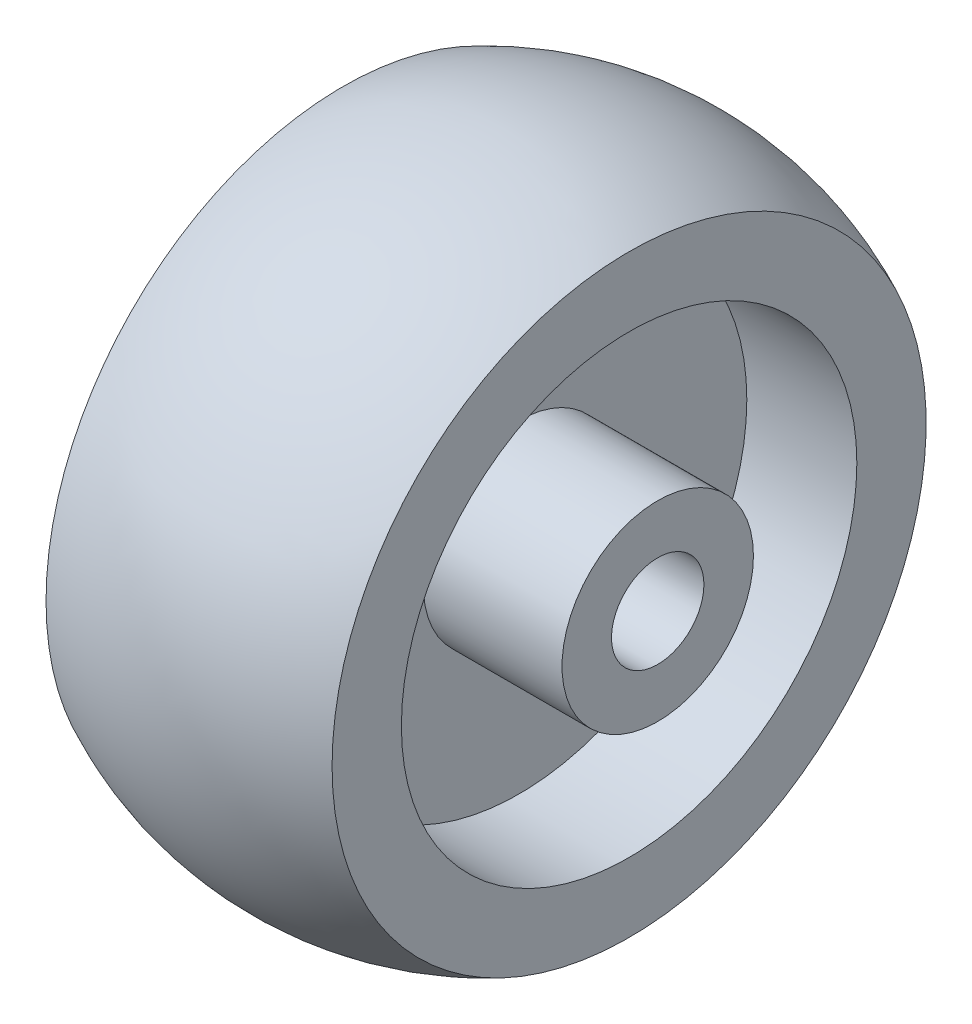
ISO-10303-21;
HEADER;
FILE_DESCRIPTION(('STEP AP214'),'2;1');
FILE_NAME('part.step','',(''),(''),'','','');
FILE_SCHEMA(('AUTOMOTIVE_DESIGN { 1 0 10303 214 1 1 1 1 }'));
ENDSEC;
DATA;
#1=APPLICATION_CONTEXT('core data for automotive mechanical design processes');
#2=APPLICATION_PROTOCOL_DEFINITION('international standard','automotive_design',2000,#1);
#3=PRODUCT_CONTEXT('',#1,'mechanical');
#4=PRODUCT('Part','Part','',(#3));
#5=PRODUCT_RELATED_PRODUCT_CATEGORY('part','',(#4));
#6=PRODUCT_DEFINITION_FORMATION('','',#4);
#7=PRODUCT_DEFINITION_CONTEXT('part definition',#1,'design');
#8=PRODUCT_DEFINITION('design','',#6,#7);
#9=PRODUCT_DEFINITION_SHAPE('','',#8);
#10=(LENGTH_UNIT() NAMED_UNIT(*) SI_UNIT(.MILLI.,.METRE.));
#11=(NAMED_UNIT(*) PLANE_ANGLE_UNIT() SI_UNIT($,.RADIAN.));
#12=(NAMED_UNIT(*) SI_UNIT($,.STERADIAN.) SOLID_ANGLE_UNIT());
#13=UNCERTAINTY_MEASURE_WITH_UNIT(LENGTH_MEASURE(1.E-05),#10,'distance_accuracy_value','');
#14=(GEOMETRIC_REPRESENTATION_CONTEXT(3) GLOBAL_UNCERTAINTY_ASSIGNED_CONTEXT((#13)) GLOBAL_UNIT_ASSIGNED_CONTEXT((#10,
#11,#12)) REPRESENTATION_CONTEXT('',''));
#15=CARTESIAN_POINT('',(0.,0.,0.));
#16=DIRECTION('',(0.,0.,1.));
#17=DIRECTION('',(1.,0.,0.));
#18=AXIS2_PLACEMENT_3D('',#15,#16,#17);
#19=CARTESIAN_POINT('',(-6.5,0.,0.));
#20=DIRECTION('',(1.,0.,0.));
#21=DIRECTION('',(0.,0.,-1.));
#22=AXIS2_PLACEMENT_3D('',#19,#20,#21);
#23=PLANE('',#22);
#24=CARTESIAN_POINT('',(-6.5,0.,0.));
#25=DIRECTION('',(1.,0.,0.));
#26=DIRECTION('',(0.,0.,-1.));
#27=AXIS2_PLACEMENT_3D('',#24,#25,#26);
#28=CIRCLE('',#27,10.35);
#29=CARTESIAN_POINT('',(-6.5,0.,-10.35));
#30=VERTEX_POINT('',#29);
#31=EDGE_CURVE('E69',#30,#30,#28,.T.);
#32=ORIENTED_EDGE('',*,*,#31,.T.);
#33=EDGE_LOOP('',(#32));
#34=FACE_BOUND('',#33,.T.);
#35=CARTESIAN_POINT('',(-6.5,0.,0.));
#36=DIRECTION('',(-1.,0.,0.));
#37=DIRECTION('',(0.,0.,1.));
#38=AXIS2_PLACEMENT_3D('',#35,#36,#37);
#39=CIRCLE('',#38,13.5);
#40=CARTESIAN_POINT('',(-6.5,0.,13.5));
#41=VERTEX_POINT('',#40);
#42=EDGE_CURVE('E44',#41,#41,#39,.T.);
#43=ORIENTED_EDGE('',*,*,#42,.T.);
#44=EDGE_LOOP('',(#43));
#45=FACE_BOUND('',#44,.T.);
#46=ADVANCED_FACE('F34',(#34,#45),#23,.F.);
#47=CARTESIAN_POINT('',(0.,0.,0.));
#48=DIRECTION('',(-1.,0.,0.));
#49=DIRECTION('',(0.,0.,1.));
#50=AXIS2_PLACEMENT_3D('',#47,#48,#49);
#51=DEGENERATE_TOROIDAL_SURFACE('',#50,0.0185058345957747,15.,.F.);
#52=ORIENTED_EDGE('',*,*,#42,.F.);
#53=EDGE_LOOP('',(#52));
#54=FACE_BOUND('',#53,.T.);
#55=CARTESIAN_POINT('',(6.5,0.,0.));
#56=DIRECTION('',(-1.,0.,0.));
#57=DIRECTION('',(0.,0.,1.));
#58=AXIS2_PLACEMENT_3D('',#55,#56,#57);
#59=CIRCLE('',#58,13.5);
#60=CARTESIAN_POINT('',(6.5,0.,13.5));
#61=VERTEX_POINT('',#60);
#62=EDGE_CURVE('E48',#61,#61,#59,.T.);
#63=ORIENTED_EDGE('',*,*,#62,.T.);
#64=EDGE_LOOP('',(#63));
#65=FACE_BOUND('',#64,.T.);
#66=ADVANCED_FACE('F106',(#54,#65),#51,.F.);
#67=CARTESIAN_POINT('',(6.5,0.,0.));
#68=DIRECTION('',(-1.,0.,0.));
#69=DIRECTION('',(0.,0.,1.));
#70=AXIS2_PLACEMENT_3D('',#67,#68,#69);
#71=PLANE('',#70);
#72=CARTESIAN_POINT('',(6.5,0.,0.));
#73=DIRECTION('',(1.,0.,0.));
#74=DIRECTION('',(0.,0.,-1.));
#75=AXIS2_PLACEMENT_3D('',#72,#73,#74);
#76=CIRCLE('',#75,10.35);
#77=CARTESIAN_POINT('',(6.5,0.,-10.35));
#78=VERTEX_POINT('',#77);
#79=EDGE_CURVE('E54',#78,#78,#76,.T.);
#80=ORIENTED_EDGE('',*,*,#79,.F.);
#81=EDGE_LOOP('',(#80));
#82=FACE_BOUND('',#81,.T.);
#83=ORIENTED_EDGE('',*,*,#62,.F.);
#84=EDGE_LOOP('',(#83));
#85=FACE_BOUND('',#84,.T.);
#86=ADVANCED_FACE('F111',(#82,#85),#71,.F.);
#87=CARTESIAN_POINT('',(1.5,0.,0.));
#88=DIRECTION('',(1.,0.,0.));
#89=DIRECTION('',(0.,0.,-1.));
#90=AXIS2_PLACEMENT_3D('',#87,#88,#89);
#91=CYLINDRICAL_SURFACE('',#90,10.35);
#92=CARTESIAN_POINT('',(1.5,0.,0.));
#93=DIRECTION('',(1.,0.,0.));
#94=DIRECTION('',(0.,0.,-1.));
#95=AXIS2_PLACEMENT_3D('',#92,#93,#94);
#96=CIRCLE('',#95,10.35);
#97=CARTESIAN_POINT('',(1.5,0.,-10.35));
#98=VERTEX_POINT('',#97);
#99=EDGE_CURVE('E53',#98,#98,#96,.T.);
#100=ORIENTED_EDGE('',*,*,#99,.F.);
#101=EDGE_LOOP('',(#100));
#102=FACE_BOUND('',#101,.T.);
#103=ORIENTED_EDGE('',*,*,#79,.T.);
#104=EDGE_LOOP('',(#103));
#105=FACE_BOUND('',#104,.T.);
#106=ADVANCED_FACE('F120',(#102,#105),#91,.F.);
#107=CARTESIAN_POINT('',(1.5,0.,0.));
#108=DIRECTION('',(1.,0.,0.));
#109=DIRECTION('',(0.,0.,-1.));
#110=AXIS2_PLACEMENT_3D('',#107,#108,#109);
#111=PLANE('',#110);
#112=CARTESIAN_POINT('',(1.5,0.,0.));
#113=DIRECTION('',(1.,0.,0.));
#114=DIRECTION('',(0.,0.,-1.));
#115=AXIS2_PLACEMENT_3D('',#112,#113,#114);
#116=CIRCLE('',#115,4.35);
#117=CARTESIAN_POINT('',(1.5,0.,-4.35));
#118=VERTEX_POINT('',#117);
#119=EDGE_CURVE('E60',#118,#118,#116,.T.);
#120=ORIENTED_EDGE('',*,*,#119,.F.);
#121=EDGE_LOOP('',(#120));
#122=FACE_BOUND('',#121,.T.);
#123=ORIENTED_EDGE('',*,*,#99,.T.);
#124=EDGE_LOOP('',(#123));
#125=FACE_BOUND('',#124,.T.);
#126=ADVANCED_FACE('F126',(#122,#125),#111,.T.);
#127=CARTESIAN_POINT('',(7.8,0.,0.));
#128=DIRECTION('',(1.,0.,0.));
#129=DIRECTION('',(0.,0.,-1.));
#130=AXIS2_PLACEMENT_3D('',#127,#128,#129);
#131=PLANE('',#130);
#132=CARTESIAN_POINT('',(7.8,0.,0.));
#133=DIRECTION('',(1.,0.,0.));
#134=DIRECTION('',(0.,0.,-1.));
#135=AXIS2_PLACEMENT_3D('',#132,#133,#134);
#136=CIRCLE('',#135,4.35);
#137=CARTESIAN_POINT('',(7.8,0.,-4.35));
#138=VERTEX_POINT('',#137);
#139=EDGE_CURVE('E57',#138,#138,#136,.T.);
#140=ORIENTED_EDGE('',*,*,#139,.T.);
#141=EDGE_LOOP('',(#140));
#142=FACE_BOUND('',#141,.T.);
#143=CARTESIAN_POINT('',(7.8,0.,0.));
#144=DIRECTION('',(1.,0.,0.));
#145=DIRECTION('',(0.,0.,-1.));
#146=AXIS2_PLACEMENT_3D('',#143,#144,#145);
#147=CIRCLE('',#146,2.1);
#148=CARTESIAN_POINT('',(7.8,0.,-2.1));
#149=VERTEX_POINT('',#148);
#150=EDGE_CURVE('E63',#149,#149,#147,.T.);
#151=ORIENTED_EDGE('',*,*,#150,.F.);
#152=EDGE_LOOP('',(#151));
#153=FACE_BOUND('',#152,.T.);
#154=ADVANCED_FACE('F133',(#142,#153),#131,.T.);
#155=CARTESIAN_POINT('',(7.8,0.,0.));
#156=DIRECTION('',(-1.,0.,0.));
#157=DIRECTION('',(0.,0.,1.));
#158=AXIS2_PLACEMENT_3D('',#155,#156,#157);
#159=CYLINDRICAL_SURFACE('',#158,4.35);
#160=ORIENTED_EDGE('',*,*,#139,.F.);
#161=EDGE_LOOP('',(#160));
#162=FACE_BOUND('',#161,.T.);
#163=ORIENTED_EDGE('',*,*,#119,.T.);
#164=EDGE_LOOP('',(#163));
#165=FACE_BOUND('',#164,.T.);
#166=ADVANCED_FACE('F136',(#162,#165),#159,.T.);
#167=CARTESIAN_POINT('',(7.8,0.,0.));
#168=DIRECTION('',(-1.,0.,0.));
#169=DIRECTION('',(0.,0.,1.));
#170=AXIS2_PLACEMENT_3D('',#167,#168,#169);
#171=CYLINDRICAL_SURFACE('',#170,2.1);
#172=ORIENTED_EDGE('',*,*,#150,.T.);
#173=EDGE_LOOP('',(#172));
#174=FACE_BOUND('',#173,.T.);
#175=CARTESIAN_POINT('',(1.5,0.,0.));
#176=DIRECTION('',(1.,0.,0.));
#177=DIRECTION('',(0.,0.,-1.));
#178=AXIS2_PLACEMENT_3D('',#175,#176,#177);
#179=CIRCLE('',#178,2.1);
#180=CARTESIAN_POINT('',(1.5,0.,-2.1));
#181=VERTEX_POINT('',#180);
#182=EDGE_CURVE('E40',#181,#181,#179,.F.);
#183=ORIENTED_EDGE('',*,*,#182,.T.);
#184=EDGE_LOOP('',(#183));
#185=FACE_BOUND('',#184,.T.);
#186=ADVANCED_FACE('F139',(#174,#185),#171,.F.);
#187=ORIENTED_EDGE('',*,*,#182,.F.);
#188=EDGE_LOOP('',(#187));
#189=FACE_BOUND('',#188,.T.);
#190=ADVANCED_FACE('F135',(#189),#111,.T.);
#191=CARTESIAN_POINT('',(-1.5,0.,0.));
#192=DIRECTION('',(-1.,0.,0.));
#193=DIRECTION('',(0.,0.,1.));
#194=AXIS2_PLACEMENT_3D('',#191,#192,#193);
#195=CYLINDRICAL_SURFACE('',#194,10.35);
#196=CARTESIAN_POINT('',(-1.5,0.,0.));
#197=DIRECTION('',(1.,0.,0.));
#198=DIRECTION('',(0.,0.,-1.));
#199=AXIS2_PLACEMENT_3D('',#196,#197,#198);
#200=CIRCLE('',#199,10.35);
#201=CARTESIAN_POINT('',(-1.5,0.,-10.35));
#202=VERTEX_POINT('',#201);
#203=EDGE_CURVE('E68',#202,#202,#200,.T.);
#204=ORIENTED_EDGE('',*,*,#203,.T.);
#205=EDGE_LOOP('',(#204));
#206=FACE_BOUND('',#205,.T.);
#207=ORIENTED_EDGE('',*,*,#31,.F.);
#208=EDGE_LOOP('',(#207));
#209=FACE_BOUND('',#208,.T.);
#210=ADVANCED_FACE('F103',(#206,#209),#195,.F.);
#211=CARTESIAN_POINT('',(-1.5,0.,0.));
#212=DIRECTION('',(-1.,0.,0.));
#213=DIRECTION('',(0.,0.,-1.));
#214=AXIS2_PLACEMENT_3D('',#211,#212,#213);
#215=PLANE('',#214);
#216=CARTESIAN_POINT('',(-1.5,0.,0.));
#217=DIRECTION('',(-1.,0.,0.));
#218=DIRECTION('',(0.,0.,1.));
#219=AXIS2_PLACEMENT_3D('',#216,#217,#218);
#220=CIRCLE('',#219,4.35);
#221=CARTESIAN_POINT('',(-1.5,0.,4.35));
#222=VERTEX_POINT('',#221);
#223=EDGE_CURVE('E10',#222,#222,#220,.T.);
#224=ORIENTED_EDGE('',*,*,#223,.F.);
#225=EDGE_LOOP('',(#224));
#226=FACE_BOUND('',#225,.T.);
#227=ORIENTED_EDGE('',*,*,#203,.F.);
#228=EDGE_LOOP('',(#227));
#229=FACE_BOUND('',#228,.T.);
#230=ADVANCED_FACE('F96',(#226,#229),#215,.T.);
#231=CARTESIAN_POINT('',(-7.8,0.,0.));
#232=DIRECTION('',(1.,0.,0.));
#233=DIRECTION('',(0.,0.,-1.));
#234=AXIS2_PLACEMENT_3D('',#231,#232,#233);
#235=CYLINDRICAL_SURFACE('',#234,4.35);
#236=CARTESIAN_POINT('',(-7.8,0.,0.));
#237=DIRECTION('',(1.,0.,0.));
#238=DIRECTION('',(0.,0.,-1.));
#239=AXIS2_PLACEMENT_3D('',#236,#237,#238);
#240=CIRCLE('',#239,4.35);
#241=CARTESIAN_POINT('',(-7.8,0.,-4.35));
#242=VERTEX_POINT('',#241);
#243=EDGE_CURVE('E72',#242,#242,#240,.T.);
#244=ORIENTED_EDGE('',*,*,#243,.T.);
#245=EDGE_LOOP('',(#244));
#246=FACE_BOUND('',#245,.T.);
#247=ORIENTED_EDGE('',*,*,#223,.T.);
#248=EDGE_LOOP('',(#247));
#249=FACE_BOUND('',#248,.T.);
#250=ADVANCED_FACE('F102',(#246,#249),#235,.T.);
#251=CARTESIAN_POINT('',(-7.8,0.,0.));
#252=DIRECTION('',(-1.,0.,0.));
#253=DIRECTION('',(0.,0.,-1.));
#254=AXIS2_PLACEMENT_3D('',#251,#252,#253);
#255=PLANE('',#254);
#256=CARTESIAN_POINT('',(-7.8,0.,0.));
#257=DIRECTION('',(1.,0.,0.));
#258=DIRECTION('',(0.,0.,-1.));
#259=AXIS2_PLACEMENT_3D('',#256,#257,#258);
#260=CIRCLE('',#259,2.1);
#261=CARTESIAN_POINT('',(-7.8,0.,-2.1));
#262=VERTEX_POINT('',#261);
#263=EDGE_CURVE('E77',#262,#262,#260,.T.);
#264=ORIENTED_EDGE('',*,*,#263,.T.);
#265=EDGE_LOOP('',(#264));
#266=FACE_BOUND('',#265,.T.);
#267=ORIENTED_EDGE('',*,*,#243,.F.);
#268=EDGE_LOOP('',(#267));
#269=FACE_BOUND('',#268,.T.);
#270=ADVANCED_FACE('F84',(#266,#269),#255,.T.);
#271=CARTESIAN_POINT('',(-7.8,0.,0.));
#272=DIRECTION('',(1.,0.,0.));
#273=DIRECTION('',(0.,0.,-1.));
#274=AXIS2_PLACEMENT_3D('',#271,#272,#273);
#275=CYLINDRICAL_SURFACE('',#274,2.1);
#276=ORIENTED_EDGE('',*,*,#263,.F.);
#277=EDGE_LOOP('',(#276));
#278=FACE_BOUND('',#277,.T.);
#279=CARTESIAN_POINT('',(-1.5,0.,0.));
#280=DIRECTION('',(1.,0.,0.));
#281=DIRECTION('',(0.,0.,-1.));
#282=AXIS2_PLACEMENT_3D('',#279,#280,#281);
#283=CIRCLE('',#282,2.1);
#284=CARTESIAN_POINT('',(-1.5,0.,-2.1));
#285=VERTEX_POINT('',#284);
#286=EDGE_CURVE('E78',#285,#285,#283,.T.);
#287=ORIENTED_EDGE('',*,*,#286,.T.);
#288=EDGE_LOOP('',(#287));
#289=FACE_BOUND('',#288,.T.);
#290=ADVANCED_FACE('F87',(#278,#289),#275,.F.);
#291=ORIENTED_EDGE('',*,*,#286,.F.);
#292=EDGE_LOOP('',(#291));
#293=FACE_BOUND('',#292,.T.);
#294=ADVANCED_FACE('F90',(#293),#215,.T.);
#295=CLOSED_SHELL('',(#46,#66,#86,#106,#126,#154,#166,#186,#190,#210,#230,#250,#270,#290,#294));
#296=MANIFOLD_SOLID_BREP('B2',#295);
#297=ADVANCED_BREP_SHAPE_REPRESENTATION('',(#18,#296),#14);
#298=SHAPE_DEFINITION_REPRESENTATION(#9,#297);
ENDSEC;
END-ISO-10303-21;
